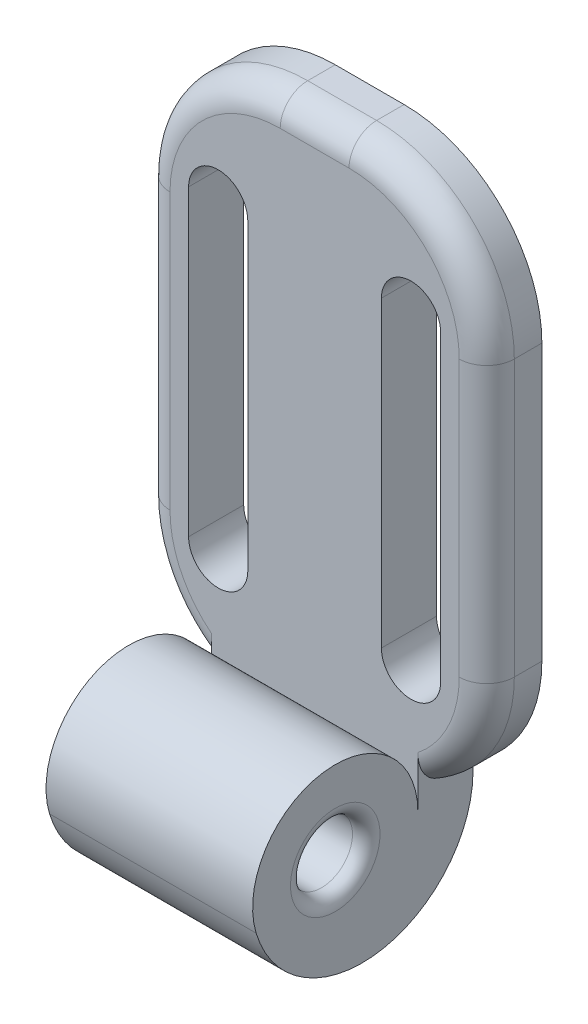
ISO-10303-21;
HEADER;
FILE_DESCRIPTION(('STEP AP214'),'2;1');
FILE_NAME('part.step','',(''),(''),'','','');
FILE_SCHEMA(('AUTOMOTIVE_DESIGN { 1 0 10303 214 1 1 1 1 }'));
ENDSEC;
DATA;
#1=APPLICATION_CONTEXT('core data for automotive mechanical design processes');
#2=APPLICATION_PROTOCOL_DEFINITION('international standard','automotive_design',2000,#1);
#3=PRODUCT_CONTEXT('',#1,'mechanical');
#4=PRODUCT('Part','Part','',(#3));
#5=PRODUCT_RELATED_PRODUCT_CATEGORY('part','',(#4));
#6=PRODUCT_DEFINITION_FORMATION('','',#4);
#7=PRODUCT_DEFINITION_CONTEXT('part definition',#1,'design');
#8=PRODUCT_DEFINITION('design','',#6,#7);
#9=PRODUCT_DEFINITION_SHAPE('','',#8);
#10=(LENGTH_UNIT() NAMED_UNIT(*) SI_UNIT(.MILLI.,.METRE.));
#11=(NAMED_UNIT(*) PLANE_ANGLE_UNIT() SI_UNIT($,.RADIAN.));
#12=(NAMED_UNIT(*) SI_UNIT($,.STERADIAN.) SOLID_ANGLE_UNIT());
#13=UNCERTAINTY_MEASURE_WITH_UNIT(LENGTH_MEASURE(1.E-05),#10,'distance_accuracy_value','');
#14=(GEOMETRIC_REPRESENTATION_CONTEXT(3) GLOBAL_UNCERTAINTY_ASSIGNED_CONTEXT((#13)) GLOBAL_UNIT_ASSIGNED_CONTEXT((#10,
#11,#12)) REPRESENTATION_CONTEXT('',''));
#15=CARTESIAN_POINT('',(0.,0.,0.));
#16=DIRECTION('',(0.,0.,1.));
#17=DIRECTION('',(1.,0.,0.));
#18=AXIS2_PLACEMENT_3D('',#15,#16,#17);
#19=CARTESIAN_POINT('',(2.5,-10.,2.));
#20=DIRECTION('',(0.,0.,-1.));
#21=DIRECTION('',(-1.,0.,0.));
#22=AXIS2_PLACEMENT_3D('',#19,#20,#21);
#23=CYLINDRICAL_SURFACE('',#22,10.);
#24=DIRECTION('',(0.,0.,-1.));
#25=VECTOR('',#24,1.);
#26=CARTESIAN_POINT('',(12.5,-10.,2.));
#27=LINE('',#26,#25);
#28=CARTESIAN_POINT('',(12.5,-10.,0.));
#29=VERTEX_POINT('',#28);
#30=CARTESIAN_POINT('',(12.5,-10.,-2.));
#31=VERTEX_POINT('',#30);
#32=EDGE_CURVE('E331',#29,#31,#27,.T.);
#33=ORIENTED_EDGE('',*,*,#32,.F.);
#34=CARTESIAN_POINT('',(2.5,-10.,0.));
#35=DIRECTION('',(0.,0.,1.));
#36=DIRECTION('',(1.,0.,0.));
#37=AXIS2_PLACEMENT_3D('',#34,#35,#36);
#38=CIRCLE('',#37,10.);
#39=CARTESIAN_POINT('',(7.5,-18.6602540378444,0.));
#40=VERTEX_POINT('',#39);
#41=EDGE_CURVE('E427',#29,#40,#38,.F.);
#42=ORIENTED_EDGE('',*,*,#41,.T.);
#43=DIRECTION('',(0.,0.,-1.));
#44=VECTOR('',#43,1.);
#45=CARTESIAN_POINT('',(7.5,-18.6602540378444,-1.96489611028141));
#46=LINE('',#45,#44);
#47=CARTESIAN_POINT('',(7.5,-18.6602540378444,-1.96489611028141));
#48=VERTEX_POINT('',#47);
#49=EDGE_CURVE('E563',#48,#40,#46,.F.);
#50=ORIENTED_EDGE('',*,*,#49,.F.);
#51=CARTESIAN_POINT('',(2.5,-20.,-1.9783983446287));
#52=CARTESIAN_POINT('',(2.64186760050505,-19.999999746551,-1.97839295554293));
#53=CARTESIAN_POINT('',(2.78371686605524,-19.9969805017068,-1.97862080032294));
#54=CARTESIAN_POINT('',(3.06715795107285,-19.9849116020364,-1.97949540676608));
#55=CARTESIAN_POINT('',(3.20874976943013,-19.9758619212677,-1.98014217023135));
#56=CARTESIAN_POINT('',(3.63281796616455,-19.9396776070167,-1.98263957867114));
#57=CARTESIAN_POINT('',(3.91457509372322,-19.9035077028679,-1.98504733413064));
#58=CARTESIAN_POINT('',(4.46785804455253,-19.8083968762895,-1.99030889522554));
#59=CARTESIAN_POINT('',(4.7394731566663,-19.7499677708788,-1.99315187299346));
#60=CARTESIAN_POINT('',(5.27684720048713,-19.6107277259163,-1.99781955237782));
#61=CARTESIAN_POINT('',(5.54260843205992,-19.5299257518355,-1.99964466100337));
#62=CARTESIAN_POINT('',(5.95059245908701,-19.3870866141653,-2.00012588343242));
#63=CARTESIAN_POINT('',(6.09548428159392,-19.3325481900873,-1.99982633879001));
#64=CARTESIAN_POINT('',(6.38255071250919,-19.2168181772994,-1.99786648805909));
#65=CARTESIAN_POINT('',(6.5247259292577,-19.1556280991463,-1.99620649036492));
#66=CARTESIAN_POINT('',(6.80779316002274,-19.0259320422032,-1.99104764599372));
#67=CARTESIAN_POINT('',(6.94864767155893,-18.9573450812211,-1.98752635396666));
#68=CARTESIAN_POINT('',(7.22696626642258,-18.8136455743175,-1.97811625971671));
#69=CARTESIAN_POINT('',(7.36442917399904,-18.7385308051333,-1.972226648387));
#70=CARTESIAN_POINT('',(7.5,-18.6602540378444,-1.96489611028141));
#71=B_SPLINE_CURVE_WITH_KNOTS('',3,(#51,#52,#53,#54,#55,#56,#57,#58,#59,#60,#61,#62,#63,#64,#65,
#66,#67,#68,#69,#70),.UNSPECIFIED.,.F.,.F.,(4,2,2,2,2,2,2,2,2,4),(0.,0.42553394488738,
0.851069720391812,1.70217713109816,2.53479264828368,3.36707499346229,3.8313781150964,
4.2955760152662,4.76550385534796,5.23559237701044),.UNSPECIFIED.);
#72=CARTESIAN_POINT('',(5.88155054004866,-19.4109040981776,-2.));
#73=VERTEX_POINT('',#72);
#74=EDGE_CURVE('E226',#73,#48,#71,.T.);
#75=ORIENTED_EDGE('',*,*,#74,.F.);
#76=CARTESIAN_POINT('',(2.5,-10.,-2.));
#77=DIRECTION('',(0.,0.,1.));
#78=DIRECTION('',(1.,0.,0.));
#79=AXIS2_PLACEMENT_3D('',#76,#77,#78);
#80=CIRCLE('',#79,10.);
#81=EDGE_CURVE('E317',#31,#73,#80,.F.);
#82=ORIENTED_EDGE('',*,*,#81,.F.);
#83=EDGE_LOOP('',(#33,#42,#50,#75,#82));
#84=FACE_BOUND('',#83,.T.);
#85=ADVANCED_FACE('F38',(#84),#23,.T.);
#86=CARTESIAN_POINT('',(-2.5,-10.,2.));
#87=DIRECTION('',(0.,0.,-1.));
#88=DIRECTION('',(-1.,0.,0.));
#89=AXIS2_PLACEMENT_3D('',#86,#87,#88);
#90=CYLINDRICAL_SURFACE('',#89,10.);
#91=DIRECTION('',(0.,0.,-1.));
#92=VECTOR('',#91,1.);
#93=CARTESIAN_POINT('',(-7.5,-18.6602540378444,2.15148901369864));
#94=LINE('',#93,#92);
#95=CARTESIAN_POINT('',(-7.5,-18.6602540378444,0.));
#96=VERTEX_POINT('',#95);
#97=CARTESIAN_POINT('',(-7.5,-18.6602540378444,-1.96489611028141));
#98=VERTEX_POINT('',#97);
#99=EDGE_CURVE('E342',#96,#98,#94,.T.);
#100=ORIENTED_EDGE('',*,*,#99,.F.);
#101=CARTESIAN_POINT('',(-2.5,-10.,0.));
#102=DIRECTION('',(0.,0.,1.));
#103=DIRECTION('',(1.,0.,0.));
#104=AXIS2_PLACEMENT_3D('',#101,#102,#103);
#105=CIRCLE('',#104,10.);
#106=CARTESIAN_POINT('',(-12.5,-10.,0.));
#107=VERTEX_POINT('',#106);
#108=EDGE_CURVE('E526',#96,#107,#105,.F.);
#109=ORIENTED_EDGE('',*,*,#108,.T.);
#110=DIRECTION('',(0.,0.,-1.));
#111=VECTOR('',#110,1.);
#112=CARTESIAN_POINT('',(-12.5,-10.,2.));
#113=LINE('',#112,#111);
#114=CARTESIAN_POINT('',(-12.5,-10.,-2.));
#115=VERTEX_POINT('',#114);
#116=EDGE_CURVE('E313',#115,#107,#113,.F.);
#117=ORIENTED_EDGE('',*,*,#116,.F.);
#118=CARTESIAN_POINT('',(-2.5,-10.,-2.));
#119=DIRECTION('',(0.,0.,1.));
#120=DIRECTION('',(1.,0.,0.));
#121=AXIS2_PLACEMENT_3D('',#118,#119,#120);
#122=CIRCLE('',#121,10.);
#123=CARTESIAN_POINT('',(-5.88155054004873,-19.4109040981776,-2.));
#124=VERTEX_POINT('',#123);
#125=EDGE_CURVE('E321',#124,#115,#122,.F.);
#126=ORIENTED_EDGE('',*,*,#125,.F.);
#127=CARTESIAN_POINT('',(-7.5,-18.6602540378444,-1.96489611028141));
#128=CARTESIAN_POINT('',(-7.37835741925429,-18.7304853772474,-1.97147584279426));
#129=CARTESIAN_POINT('',(-7.25520689892478,-18.7981676404518,-1.97689182176764));
#130=CARTESIAN_POINT('',(-7.00611731084825,-18.9283061736355,-1.98577464074202));
#131=CARTESIAN_POINT('',(-6.8801784592567,-18.9907628469287,-1.98924163128534));
#132=CARTESIAN_POINT('',(-6.49854517797315,-19.1700933613475,-1.99728667048723));
#133=CARTESIAN_POINT('',(-6.23898279763278,-19.2789572684462,-1.9995112295903));
#134=CARTESIAN_POINT('',(-5.71729600367854,-19.4723152274808,-2.00033426273404));
#135=CARTESIAN_POINT('',(-5.45534544579028,-19.5572811682111,-1.99900935729803));
#136=CARTESIAN_POINT('',(-4.92543964423298,-19.705303077293,-1.99495089409765));
#137=CARTESIAN_POINT('',(-4.6574863536032,-19.7683660648338,-1.99221778831461));
#138=CARTESIAN_POINT('',(-4.07851442157039,-19.8796321951995,-1.98655450483695));
#139=CARTESIAN_POINT('',(-3.76682541344804,-19.9244123891989,-1.98365218480632));
#140=CARTESIAN_POINT('',(-3.29533416928575,-19.9695950009,-1.98058548725858));
#141=CARTESIAN_POINT('',(-3.13651297297785,-19.98099201256,-1.97977679528524));
#142=CARTESIAN_POINT('',(-2.81847007053376,-19.9961951613942,-1.9786788959837));
#143=CARTESIAN_POINT('',(-2.65924828229678,-19.9999995894349,-1.9783898056222));
#144=CARTESIAN_POINT('',(-2.5,-20.,-1.9783983446287));
#145=B_SPLINE_CURVE_WITH_KNOTS('',3,(#127,#128,#129,#130,#131,#132,#133,#134,#135,#136,#137,
#138,#139,#140,#141,#142,#143,#144),.UNSPECIFIED.,.F.,.F.,(4,2,2,2,2,2,2,2,4),(0.,
0.421766860485485,0.843501138688041,1.686792722017,2.5120280583836,3.33699868893002,
4.28015107477193,4.75768996184715,5.23533633349714),.UNSPECIFIED.);
#146=EDGE_CURVE('E344',#98,#124,#145,.T.);
#147=ORIENTED_EDGE('',*,*,#146,.F.);
#148=EDGE_LOOP('',(#100,#109,#117,#126,#147));
#149=FACE_BOUND('',#148,.T.);
#150=ADVANCED_FACE('F370',(#149),#90,.T.);
#151=CARTESIAN_POINT('',(0.,0.,2.));
#152=DIRECTION('',(0.,0.,1.));
#153=DIRECTION('',(1.,0.,0.));
#154=AXIS2_PLACEMENT_3D('',#151,#152,#153);
#155=PLANE('',#154);
#156=DIRECTION('',(0.,1.,0.));
#157=VECTOR('',#156,1.);
#158=CARTESIAN_POINT('',(7.5,0.,2.));
#159=LINE('',#158,#157);
#160=CARTESIAN_POINT('',(7.5,-16.2449979983984,2.));
#161=VERTEX_POINT('',#160);
#162=CARTESIAN_POINT('',(7.5,-20.,2.));
#163=VERTEX_POINT('',#162);
#164=EDGE_CURVE('E214',#161,#163,#159,.F.);
#165=ORIENTED_EDGE('',*,*,#164,.F.);
#166=CARTESIAN_POINT('',(2.5,-10.,2.));
#167=DIRECTION('',(0.,0.,1.));
#168=DIRECTION('',(1.,0.,0.));
#169=AXIS2_PLACEMENT_3D('',#166,#167,#168);
#170=CIRCLE('',#169,8.);
#171=CARTESIAN_POINT('',(10.5,-10.,2.));
#172=VERTEX_POINT('',#171);
#173=EDGE_CURVE('E437',#161,#172,#170,.T.);
#174=ORIENTED_EDGE('',*,*,#173,.T.);
#175=DIRECTION('',(0.,1.,0.));
#176=VECTOR('',#175,1.);
#177=CARTESIAN_POINT('',(10.5,10.,2.));
#178=LINE('',#177,#176);
#179=CARTESIAN_POINT('',(10.5,10.,2.));
#180=VERTEX_POINT('',#179);
#181=EDGE_CURVE('E442',#172,#180,#178,.T.);
#182=ORIENTED_EDGE('',*,*,#181,.T.);
#183=CARTESIAN_POINT('',(2.5,10.,2.));
#184=DIRECTION('',(0.,0.,1.));
#185=DIRECTION('',(1.,0.,0.));
#186=AXIS2_PLACEMENT_3D('',#183,#184,#185);
#187=CIRCLE('',#186,8.);
#188=CARTESIAN_POINT('',(2.5,18.,2.));
#189=VERTEX_POINT('',#188);
#190=EDGE_CURVE('E500',#180,#189,#187,.T.);
#191=ORIENTED_EDGE('',*,*,#190,.T.);
#192=DIRECTION('',(-1.,0.,0.));
#193=VECTOR('',#192,1.);
#194=CARTESIAN_POINT('',(-2.5,18.,2.));
#195=LINE('',#194,#193);
#196=CARTESIAN_POINT('',(-2.5,18.,2.));
#197=VERTEX_POINT('',#196);
#198=EDGE_CURVE('E504',#189,#197,#195,.T.);
#199=ORIENTED_EDGE('',*,*,#198,.T.);
#200=CARTESIAN_POINT('',(-2.5,10.,2.));
#201=DIRECTION('',(0.,0.,1.));
#202=DIRECTION('',(1.,0.,0.));
#203=AXIS2_PLACEMENT_3D('',#200,#201,#202);
#204=CIRCLE('',#203,8.);
#205=CARTESIAN_POINT('',(-10.5,10.,2.));
#206=VERTEX_POINT('',#205);
#207=EDGE_CURVE('E508',#197,#206,#204,.T.);
#208=ORIENTED_EDGE('',*,*,#207,.T.);
#209=DIRECTION('',(0.,-1.,0.));
#210=VECTOR('',#209,1.);
#211=CARTESIAN_POINT('',(-10.5,-10.,2.));
#212=LINE('',#211,#210);
#213=CARTESIAN_POINT('',(-10.5,-10.,2.));
#214=VERTEX_POINT('',#213);
#215=EDGE_CURVE('E511',#206,#214,#212,.T.);
#216=ORIENTED_EDGE('',*,*,#215,.T.);
#217=CARTESIAN_POINT('',(-2.5,-10.,2.));
#218=DIRECTION('',(0.,0.,1.));
#219=DIRECTION('',(1.,0.,0.));
#220=AXIS2_PLACEMENT_3D('',#217,#218,#219);
#221=CIRCLE('',#220,8.);
#222=CARTESIAN_POINT('',(-7.5,-16.2449979983984,2.));
#223=VERTEX_POINT('',#222);
#224=EDGE_CURVE('E518',#214,#223,#221,.T.);
#225=ORIENTED_EDGE('',*,*,#224,.T.);
#226=DIRECTION('',(0.,-1.,0.));
#227=VECTOR('',#226,1.);
#228=CARTESIAN_POINT('',(-7.5,0.,2.));
#229=LINE('',#228,#227);
#230=CARTESIAN_POINT('',(-7.5,-20.,2.));
#231=VERTEX_POINT('',#230);
#232=EDGE_CURVE('E509',#223,#231,#229,.T.);
#233=ORIENTED_EDGE('',*,*,#232,.T.);
#234=DIRECTION('',(-1.,0.,0.));
#235=VECTOR('',#234,1.);
#236=CARTESIAN_POINT('',(7.5,-20.,2.));
#237=LINE('',#236,#235);
#238=EDGE_CURVE('E227',#163,#231,#237,.T.);
#239=ORIENTED_EDGE('',*,*,#238,.F.);
#240=EDGE_LOOP('',(#165,#174,#182,#191,#199,#208,#216,#225,#233,#239));
#241=FACE_BOUND('',#240,.T.);
#242=DIRECTION('',(0.,1.,0.));
#243=VECTOR('',#242,1.);
#244=CARTESIAN_POINT('',(-4.85,-11.,2.));
#245=LINE('',#244,#243);
#246=CARTESIAN_POINT('',(-4.85,-11.,2.));
#247=VERTEX_POINT('',#246);
#248=CARTESIAN_POINT('',(-4.85,11.,2.));
#249=VERTEX_POINT('',#248);
#250=EDGE_CURVE('E273',#247,#249,#245,.T.);
#251=ORIENTED_EDGE('',*,*,#250,.F.);
#252=CARTESIAN_POINT('',(-7.,-11.,2.));
#253=DIRECTION('',(0.,0.,1.));
#254=DIRECTION('',(1.,0.,0.));
#255=AXIS2_PLACEMENT_3D('',#252,#253,#254);
#256=CIRCLE('',#255,2.15);
#257=CARTESIAN_POINT('',(-9.15,-11.,2.));
#258=VERTEX_POINT('',#257);
#259=EDGE_CURVE('E271',#258,#247,#256,.T.);
#260=ORIENTED_EDGE('',*,*,#259,.F.);
#261=DIRECTION('',(0.,-1.,0.));
#262=VECTOR('',#261,1.);
#263=CARTESIAN_POINT('',(-9.15,-11.,2.));
#264=LINE('',#263,#262);
#265=CARTESIAN_POINT('',(-9.15,11.,2.));
#266=VERTEX_POINT('',#265);
#267=EDGE_CURVE('E279',#266,#258,#264,.T.);
#268=ORIENTED_EDGE('',*,*,#267,.F.);
#269=CARTESIAN_POINT('',(-7.,11.,2.));
#270=DIRECTION('',(0.,0.,1.));
#271=DIRECTION('',(1.,0.,0.));
#272=AXIS2_PLACEMENT_3D('',#269,#270,#271);
#273=CIRCLE('',#272,2.15);
#274=EDGE_CURVE('E276',#249,#266,#273,.T.);
#275=ORIENTED_EDGE('',*,*,#274,.F.);
#276=EDGE_LOOP('',(#251,#260,#268,#275));
#277=FACE_BOUND('',#276,.T.);
#278=DIRECTION('',(0.,1.,0.));
#279=VECTOR('',#278,1.);
#280=CARTESIAN_POINT('',(9.15,-11.,2.));
#281=LINE('',#280,#279);
#282=CARTESIAN_POINT('',(9.15,-11.,2.));
#283=VERTEX_POINT('',#282);
#284=CARTESIAN_POINT('',(9.15,11.,2.));
#285=VERTEX_POINT('',#284);
#286=EDGE_CURVE('E245',#283,#285,#281,.T.);
#287=ORIENTED_EDGE('',*,*,#286,.F.);
#288=CARTESIAN_POINT('',(7.,-11.,2.));
#289=DIRECTION('',(0.,0.,1.));
#290=DIRECTION('',(-1.,0.,0.));
#291=AXIS2_PLACEMENT_3D('',#288,#289,#290);
#292=CIRCLE('',#291,2.15);
#293=CARTESIAN_POINT('',(4.85,-11.,2.));
#294=VERTEX_POINT('',#293);
#295=EDGE_CURVE('E243',#294,#283,#292,.T.);
#296=ORIENTED_EDGE('',*,*,#295,.F.);
#297=DIRECTION('',(0.,-1.,0.));
#298=VECTOR('',#297,1.);
#299=CARTESIAN_POINT('',(4.85,-11.,2.));
#300=LINE('',#299,#298);
#301=CARTESIAN_POINT('',(4.85,11.,2.));
#302=VERTEX_POINT('',#301);
#303=EDGE_CURVE('E251',#302,#294,#300,.T.);
#304=ORIENTED_EDGE('',*,*,#303,.F.);
#305=CARTESIAN_POINT('',(7.,11.,2.));
#306=DIRECTION('',(0.,0.,1.));
#307=DIRECTION('',(-1.,0.,0.));
#308=AXIS2_PLACEMENT_3D('',#305,#306,#307);
#309=CIRCLE('',#308,2.15);
#310=EDGE_CURVE('E248',#285,#302,#309,.T.);
#311=ORIENTED_EDGE('',*,*,#310,.F.);
#312=EDGE_LOOP('',(#287,#296,#304,#311));
#313=FACE_BOUND('',#312,.T.);
#314=ADVANCED_FACE('F422',(#241,#277,#313),#155,.T.);
#315=CARTESIAN_POINT('',(0.,0.,-2.));
#316=DIRECTION('',(0.,0.,1.));
#317=DIRECTION('',(1.,0.,0.));
#318=AXIS2_PLACEMENT_3D('',#315,#316,#317);
#319=PLANE('',#318);
#320=CARTESIAN_POINT('',(-7.,-11.,-2.));
#321=DIRECTION('',(0.,0.,1.));
#322=DIRECTION('',(1.,0.,0.));
#323=AXIS2_PLACEMENT_3D('',#320,#321,#322);
#324=CIRCLE('',#323,2.15);
#325=CARTESIAN_POINT('',(-9.15,-11.,-2.));
#326=VERTEX_POINT('',#325);
#327=CARTESIAN_POINT('',(-4.85,-11.,-2.));
#328=VERTEX_POINT('',#327);
#329=EDGE_CURVE('E270',#326,#328,#324,.T.);
#330=ORIENTED_EDGE('',*,*,#329,.T.);
#331=DIRECTION('',(0.,1.,0.));
#332=VECTOR('',#331,1.);
#333=CARTESIAN_POINT('',(-4.85,-11.,-2.));
#334=LINE('',#333,#332);
#335=CARTESIAN_POINT('',(-4.85,11.,-2.));
#336=VERTEX_POINT('',#335);
#337=EDGE_CURVE('E284',#328,#336,#334,.T.);
#338=ORIENTED_EDGE('',*,*,#337,.T.);
#339=CARTESIAN_POINT('',(-7.,11.,-2.));
#340=DIRECTION('',(0.,0.,1.));
#341=DIRECTION('',(1.,0.,0.));
#342=AXIS2_PLACEMENT_3D('',#339,#340,#341);
#343=CIRCLE('',#342,2.15);
#344=CARTESIAN_POINT('',(-9.15,11.,-2.));
#345=VERTEX_POINT('',#344);
#346=EDGE_CURVE('E287',#336,#345,#343,.T.);
#347=ORIENTED_EDGE('',*,*,#346,.T.);
#348=DIRECTION('',(0.,-1.,0.));
#349=VECTOR('',#348,1.);
#350=CARTESIAN_POINT('',(-9.15,-11.,-2.));
#351=LINE('',#350,#349);
#352=EDGE_CURVE('E274',#345,#326,#351,.T.);
#353=ORIENTED_EDGE('',*,*,#352,.T.);
#354=EDGE_LOOP('',(#330,#338,#347,#353));
#355=FACE_BOUND('',#354,.T.);
#356=DIRECTION('',(0.,-1.,0.));
#357=VECTOR('',#356,1.);
#358=CARTESIAN_POINT('',(-12.5,-20.,-2.));
#359=LINE('',#358,#357);
#360=CARTESIAN_POINT('',(-12.5,10.,-2.));
#361=VERTEX_POINT('',#360);
#362=EDGE_CURVE('E301',#361,#115,#359,.T.);
#363=ORIENTED_EDGE('',*,*,#362,.F.);
#364=CARTESIAN_POINT('',(-2.5,10.,-2.));
#365=DIRECTION('',(0.,0.,1.));
#366=DIRECTION('',(1.,0.,0.));
#367=AXIS2_PLACEMENT_3D('',#364,#365,#366);
#368=CIRCLE('',#367,10.);
#369=CARTESIAN_POINT('',(-2.5,20.,-2.));
#370=VERTEX_POINT('',#369);
#371=EDGE_CURVE('E325',#361,#370,#368,.F.);
#372=ORIENTED_EDGE('',*,*,#371,.T.);
#373=DIRECTION('',(-1.,0.,0.));
#374=VECTOR('',#373,1.);
#375=CARTESIAN_POINT('',(12.5,20.,-2.));
#376=LINE('',#375,#374);
#377=CARTESIAN_POINT('',(2.5,20.,-2.));
#378=VERTEX_POINT('',#377);
#379=EDGE_CURVE('E310',#378,#370,#376,.T.);
#380=ORIENTED_EDGE('',*,*,#379,.F.);
#381=CARTESIAN_POINT('',(2.5,10.,-2.));
#382=DIRECTION('',(0.,0.,1.));
#383=DIRECTION('',(1.,0.,0.));
#384=AXIS2_PLACEMENT_3D('',#381,#382,#383);
#385=CIRCLE('',#384,10.);
#386=CARTESIAN_POINT('',(12.5,10.,-2.));
#387=VERTEX_POINT('',#386);
#388=EDGE_CURVE('E323',#378,#387,#385,.F.);
#389=ORIENTED_EDGE('',*,*,#388,.T.);
#390=DIRECTION('',(0.,1.,0.));
#391=VECTOR('',#390,1.);
#392=CARTESIAN_POINT('',(12.5,-20.,-2.));
#393=LINE('',#392,#391);
#394=EDGE_CURVE('E307',#31,#387,#393,.T.);
#395=ORIENTED_EDGE('',*,*,#394,.F.);
#396=ORIENTED_EDGE('',*,*,#81,.T.);
#397=CARTESIAN_POINT('',(2.5,-20.,-2.));
#398=VERTEX_POINT('',#397);
#399=EDGE_CURVE('E318',#73,#398,#80,.F.);
#400=ORIENTED_EDGE('',*,*,#399,.T.);
#401=DIRECTION('',(1.,0.,0.));
#402=VECTOR('',#401,1.);
#403=CARTESIAN_POINT('',(12.5,-20.,-2.));
#404=LINE('',#403,#402);
#405=CARTESIAN_POINT('',(-2.5,-20.,-2.));
#406=VERTEX_POINT('',#405);
#407=EDGE_CURVE('E304',#406,#398,#404,.T.);
#408=ORIENTED_EDGE('',*,*,#407,.F.);
#409=EDGE_CURVE('E320',#406,#124,#122,.F.);
#410=ORIENTED_EDGE('',*,*,#409,.T.);
#411=ORIENTED_EDGE('',*,*,#125,.T.);
#412=EDGE_LOOP('',(#363,#372,#380,#389,#395,#396,#400,#408,#410,#411));
#413=FACE_BOUND('',#412,.T.);
#414=CARTESIAN_POINT('',(7.,-11.,-2.));
#415=DIRECTION('',(0.,0.,1.));
#416=DIRECTION('',(-1.,0.,0.));
#417=AXIS2_PLACEMENT_3D('',#414,#415,#416);
#418=CIRCLE('',#417,2.15);
#419=CARTESIAN_POINT('',(4.85,-11.,-2.));
#420=VERTEX_POINT('',#419);
#421=CARTESIAN_POINT('',(9.15,-11.,-2.));
#422=VERTEX_POINT('',#421);
#423=EDGE_CURVE('E233',#420,#422,#418,.T.);
#424=ORIENTED_EDGE('',*,*,#423,.T.);
#425=DIRECTION('',(0.,1.,0.));
#426=VECTOR('',#425,1.);
#427=CARTESIAN_POINT('',(9.15,-11.,-2.));
#428=LINE('',#427,#426);
#429=CARTESIAN_POINT('',(9.15,11.,-2.));
#430=VERTEX_POINT('',#429);
#431=EDGE_CURVE('E237',#422,#430,#428,.T.);
#432=ORIENTED_EDGE('',*,*,#431,.T.);
#433=CARTESIAN_POINT('',(7.,11.,-2.));
#434=DIRECTION('',(0.,0.,1.));
#435=DIRECTION('',(-1.,0.,0.));
#436=AXIS2_PLACEMENT_3D('',#433,#434,#435);
#437=CIRCLE('',#436,2.15);
#438=CARTESIAN_POINT('',(4.85,11.,-2.));
#439=VERTEX_POINT('',#438);
#440=EDGE_CURVE('E256',#430,#439,#437,.T.);
#441=ORIENTED_EDGE('',*,*,#440,.T.);
#442=DIRECTION('',(0.,-1.,0.));
#443=VECTOR('',#442,1.);
#444=CARTESIAN_POINT('',(4.85,-11.,-2.));
#445=LINE('',#444,#443);
#446=EDGE_CURVE('E246',#439,#420,#445,.T.);
#447=ORIENTED_EDGE('',*,*,#446,.T.);
#448=EDGE_LOOP('',(#424,#432,#441,#447));
#449=FACE_BOUND('',#448,.T.);
#450=ADVANCED_FACE('F537',(#355,#413,#449),#319,.F.);
#451=CARTESIAN_POINT('',(-12.5,-20.,2.));
#452=DIRECTION('',(1.,0.,0.));
#453=DIRECTION('',(0.,0.,-1.));
#454=AXIS2_PLACEMENT_3D('',#451,#452,#453);
#455=PLANE('',#454);
#456=ORIENTED_EDGE('',*,*,#116,.T.);
#457=DIRECTION('',(0.,-1.,0.));
#458=VECTOR('',#457,1.);
#459=CARTESIAN_POINT('',(-12.5,10.,0.));
#460=LINE('',#459,#458);
#461=CARTESIAN_POINT('',(-12.5,10.,0.));
#462=VERTEX_POINT('',#461);
#463=EDGE_CURVE('E61',#107,#462,#460,.F.);
#464=ORIENTED_EDGE('',*,*,#463,.T.);
#465=DIRECTION('',(0.,0.,-1.));
#466=VECTOR('',#465,1.);
#467=CARTESIAN_POINT('',(-12.5,10.,2.));
#468=LINE('',#467,#466);
#469=EDGE_CURVE('E315',#462,#361,#468,.T.);
#470=ORIENTED_EDGE('',*,*,#469,.T.);
#471=ORIENTED_EDGE('',*,*,#362,.T.);
#472=EDGE_LOOP('',(#456,#464,#470,#471));
#473=FACE_BOUND('',#472,.T.);
#474=ADVANCED_FACE('F543',(#473),#455,.F.);
#475=CARTESIAN_POINT('',(12.5,-20.,2.));
#476=DIRECTION('',(0.,1.,0.));
#477=DIRECTION('',(0.,0.,1.));
#478=AXIS2_PLACEMENT_3D('',#475,#476,#477);
#479=PLANE('',#478);
#480=DIRECTION('',(-1.,0.,0.));
#481=VECTOR('',#480,1.);
#482=CARTESIAN_POINT('',(7.5,-20.,-1.9783983446287));
#483=LINE('',#482,#481);
#484=CARTESIAN_POINT('',(2.5,-20.,-1.9783983446287));
#485=VERTEX_POINT('',#484);
#486=CARTESIAN_POINT('',(-2.5,-20.,-1.9783983446287));
#487=VERTEX_POINT('',#486);
#488=EDGE_CURVE('E234',#485,#487,#483,.T.);
#489=ORIENTED_EDGE('',*,*,#488,.T.);
#490=DIRECTION('',(0.,0.,-1.));
#491=VECTOR('',#490,1.);
#492=CARTESIAN_POINT('',(-2.5,-20.,2.));
#493=LINE('',#492,#491);
#494=EDGE_CURVE('E339',#487,#406,#493,.T.);
#495=ORIENTED_EDGE('',*,*,#494,.T.);
#496=ORIENTED_EDGE('',*,*,#407,.T.);
#497=DIRECTION('',(0.,0.,-1.));
#498=VECTOR('',#497,1.);
#499=CARTESIAN_POINT('',(2.5,-20.,2.));
#500=LINE('',#499,#498);
#501=EDGE_CURVE('E336',#398,#485,#500,.F.);
#502=ORIENTED_EDGE('',*,*,#501,.T.);
#503=EDGE_LOOP('',(#489,#495,#496,#502));
#504=FACE_BOUND('',#503,.T.);
#505=ADVANCED_FACE('F560',(#504),#479,.F.);
#506=CARTESIAN_POINT('',(12.5,-20.,2.));
#507=DIRECTION('',(-1.,0.,0.));
#508=DIRECTION('',(0.,0.,1.));
#509=AXIS2_PLACEMENT_3D('',#506,#507,#508);
#510=PLANE('',#509);
#511=DIRECTION('',(0.,0.,-1.));
#512=VECTOR('',#511,1.);
#513=CARTESIAN_POINT('',(12.5,10.,2.));
#514=LINE('',#513,#512);
#515=CARTESIAN_POINT('',(12.5,10.,0.));
#516=VERTEX_POINT('',#515);
#517=EDGE_CURVE('E333',#387,#516,#514,.F.);
#518=ORIENTED_EDGE('',*,*,#517,.T.);
#519=DIRECTION('',(0.,1.,0.));
#520=VECTOR('',#519,1.);
#521=CARTESIAN_POINT('',(12.5,-10.,0.));
#522=LINE('',#521,#520);
#523=EDGE_CURVE('E436',#516,#29,#522,.F.);
#524=ORIENTED_EDGE('',*,*,#523,.T.);
#525=ORIENTED_EDGE('',*,*,#32,.T.);
#526=ORIENTED_EDGE('',*,*,#394,.T.);
#527=EDGE_LOOP('',(#518,#524,#525,#526));
#528=FACE_BOUND('',#527,.T.);
#529=ADVANCED_FACE('F564',(#528),#510,.F.);
#530=CARTESIAN_POINT('',(12.5,20.,2.));
#531=DIRECTION('',(0.,-1.,0.));
#532=DIRECTION('',(0.,0.,-1.));
#533=AXIS2_PLACEMENT_3D('',#530,#531,#532);
#534=PLANE('',#533);
#535=DIRECTION('',(0.,0.,-1.));
#536=VECTOR('',#535,1.);
#537=CARTESIAN_POINT('',(-2.5,20.,2.));
#538=LINE('',#537,#536);
#539=CARTESIAN_POINT('',(-2.5,20.,0.));
#540=VERTEX_POINT('',#539);
#541=EDGE_CURVE('E329',#370,#540,#538,.F.);
#542=ORIENTED_EDGE('',*,*,#541,.T.);
#543=DIRECTION('',(-1.,0.,0.));
#544=VECTOR('',#543,1.);
#545=CARTESIAN_POINT('',(2.5,20.,0.));
#546=LINE('',#545,#544);
#547=CARTESIAN_POINT('',(2.5,20.,0.));
#548=VERTEX_POINT('',#547);
#549=EDGE_CURVE('E395',#540,#548,#546,.F.);
#550=ORIENTED_EDGE('',*,*,#549,.T.);
#551=DIRECTION('',(0.,0.,-1.));
#552=VECTOR('',#551,1.);
#553=CARTESIAN_POINT('',(2.5,20.,2.));
#554=LINE('',#553,#552);
#555=EDGE_CURVE('E327',#548,#378,#554,.T.);
#556=ORIENTED_EDGE('',*,*,#555,.T.);
#557=ORIENTED_EDGE('',*,*,#379,.T.);
#558=EDGE_LOOP('',(#542,#550,#556,#557));
#559=FACE_BOUND('',#558,.T.);
#560=ADVANCED_FACE('F530',(#559),#534,.F.);
#561=CARTESIAN_POINT('',(-7.,-11.,2.));
#562=DIRECTION('',(0.,0.,-1.));
#563=DIRECTION('',(-1.,0.,0.));
#564=AXIS2_PLACEMENT_3D('',#561,#562,#563);
#565=CYLINDRICAL_SURFACE('',#564,2.15);
#566=ORIENTED_EDGE('',*,*,#329,.F.);
#567=DIRECTION('',(0.,0.,-1.));
#568=VECTOR('',#567,1.);
#569=CARTESIAN_POINT('',(-9.15,-11.,2.));
#570=LINE('',#569,#568);
#571=EDGE_CURVE('E281',#258,#326,#570,.T.);
#572=ORIENTED_EDGE('',*,*,#571,.F.);
#573=ORIENTED_EDGE('',*,*,#259,.T.);
#574=DIRECTION('',(0.,0.,-1.));
#575=VECTOR('',#574,1.);
#576=CARTESIAN_POINT('',(-4.85,-11.,2.));
#577=LINE('',#576,#575);
#578=EDGE_CURVE('E298',#247,#328,#577,.T.);
#579=ORIENTED_EDGE('',*,*,#578,.T.);
#580=EDGE_LOOP('',(#566,#572,#573,#579));
#581=FACE_BOUND('',#580,.T.);
#582=ADVANCED_FACE('F571',(#581),#565,.F.);
#583=CARTESIAN_POINT('',(-4.85,-11.,2.));
#584=DIRECTION('',(-1.,0.,0.));
#585=DIRECTION('',(0.,0.,1.));
#586=AXIS2_PLACEMENT_3D('',#583,#584,#585);
#587=PLANE('',#586);
#588=ORIENTED_EDGE('',*,*,#337,.F.);
#589=ORIENTED_EDGE('',*,*,#578,.F.);
#590=ORIENTED_EDGE('',*,*,#250,.T.);
#591=DIRECTION('',(0.,0.,-1.));
#592=VECTOR('',#591,1.);
#593=CARTESIAN_POINT('',(-4.85,11.,2.));
#594=LINE('',#593,#592);
#595=EDGE_CURVE('E296',#249,#336,#594,.T.);
#596=ORIENTED_EDGE('',*,*,#595,.T.);
#597=EDGE_LOOP('',(#588,#589,#590,#596));
#598=FACE_BOUND('',#597,.T.);
#599=ADVANCED_FACE('F588',(#598),#587,.T.);
#600=CARTESIAN_POINT('',(-7.,11.,2.));
#601=DIRECTION('',(0.,0.,-1.));
#602=DIRECTION('',(-1.,0.,0.));
#603=AXIS2_PLACEMENT_3D('',#600,#601,#602);
#604=CYLINDRICAL_SURFACE('',#603,2.15);
#605=ORIENTED_EDGE('',*,*,#346,.F.);
#606=ORIENTED_EDGE('',*,*,#595,.F.);
#607=ORIENTED_EDGE('',*,*,#274,.T.);
#608=DIRECTION('',(0.,0.,-1.));
#609=VECTOR('',#608,1.);
#610=CARTESIAN_POINT('',(-9.15,11.,2.));
#611=LINE('',#610,#609);
#612=EDGE_CURVE('E294',#266,#345,#611,.T.);
#613=ORIENTED_EDGE('',*,*,#612,.T.);
#614=EDGE_LOOP('',(#605,#606,#607,#613));
#615=FACE_BOUND('',#614,.T.);
#616=ADVANCED_FACE('F592',(#615),#604,.F.);
#617=CARTESIAN_POINT('',(-9.15,-11.,2.));
#618=DIRECTION('',(1.,0.,0.));
#619=DIRECTION('',(0.,0.,-1.));
#620=AXIS2_PLACEMENT_3D('',#617,#618,#619);
#621=PLANE('',#620);
#622=ORIENTED_EDGE('',*,*,#352,.F.);
#623=ORIENTED_EDGE('',*,*,#612,.F.);
#624=ORIENTED_EDGE('',*,*,#267,.T.);
#625=ORIENTED_EDGE('',*,*,#571,.T.);
#626=EDGE_LOOP('',(#622,#623,#624,#625));
#627=FACE_BOUND('',#626,.T.);
#628=ADVANCED_FACE('F596',(#627),#621,.T.);
#629=CARTESIAN_POINT('',(7.,-11.,2.));
#630=DIRECTION('',(0.,0.,-1.));
#631=DIRECTION('',(-1.,0.,0.));
#632=AXIS2_PLACEMENT_3D('',#629,#630,#631);
#633=CYLINDRICAL_SURFACE('',#632,2.15);
#634=ORIENTED_EDGE('',*,*,#423,.F.);
#635=DIRECTION('',(0.,0.,-1.));
#636=VECTOR('',#635,1.);
#637=CARTESIAN_POINT('',(4.85,-11.,2.));
#638=LINE('',#637,#636);
#639=EDGE_CURVE('E252',#294,#420,#638,.T.);
#640=ORIENTED_EDGE('',*,*,#639,.F.);
#641=ORIENTED_EDGE('',*,*,#295,.T.);
#642=DIRECTION('',(0.,0.,-1.));
#643=VECTOR('',#642,1.);
#644=CARTESIAN_POINT('',(9.15,-11.,2.));
#645=LINE('',#644,#643);
#646=EDGE_CURVE('E267',#283,#422,#645,.T.);
#647=ORIENTED_EDGE('',*,*,#646,.T.);
#648=EDGE_LOOP('',(#634,#640,#641,#647));
#649=FACE_BOUND('',#648,.T.);
#650=ADVANCED_FACE('F600',(#649),#633,.F.);
#651=CARTESIAN_POINT('',(9.15,-11.,2.));
#652=DIRECTION('',(-1.,0.,0.));
#653=DIRECTION('',(0.,0.,1.));
#654=AXIS2_PLACEMENT_3D('',#651,#652,#653);
#655=PLANE('',#654);
#656=ORIENTED_EDGE('',*,*,#431,.F.);
#657=ORIENTED_EDGE('',*,*,#646,.F.);
#658=ORIENTED_EDGE('',*,*,#286,.T.);
#659=DIRECTION('',(0.,0.,-1.));
#660=VECTOR('',#659,1.);
#661=CARTESIAN_POINT('',(9.15,11.,2.));
#662=LINE('',#661,#660);
#663=EDGE_CURVE('E265',#285,#430,#662,.T.);
#664=ORIENTED_EDGE('',*,*,#663,.T.);
#665=EDGE_LOOP('',(#656,#657,#658,#664));
#666=FACE_BOUND('',#665,.T.);
#667=ADVANCED_FACE('F604',(#666),#655,.T.);
#668=CARTESIAN_POINT('',(7.,11.,2.));
#669=DIRECTION('',(0.,0.,-1.));
#670=DIRECTION('',(-1.,0.,0.));
#671=AXIS2_PLACEMENT_3D('',#668,#669,#670);
#672=CYLINDRICAL_SURFACE('',#671,2.15);
#673=ORIENTED_EDGE('',*,*,#440,.F.);
#674=ORIENTED_EDGE('',*,*,#663,.F.);
#675=ORIENTED_EDGE('',*,*,#310,.T.);
#676=DIRECTION('',(0.,0.,-1.));
#677=VECTOR('',#676,1.);
#678=CARTESIAN_POINT('',(4.85,11.,2.));
#679=LINE('',#678,#677);
#680=EDGE_CURVE('E263',#302,#439,#679,.T.);
#681=ORIENTED_EDGE('',*,*,#680,.T.);
#682=EDGE_LOOP('',(#673,#674,#675,#681));
#683=FACE_BOUND('',#682,.T.);
#684=ADVANCED_FACE('F608',(#683),#672,.F.);
#685=CARTESIAN_POINT('',(4.85,-11.,2.));
#686=DIRECTION('',(1.,0.,0.));
#687=DIRECTION('',(0.,0.,-1.));
#688=AXIS2_PLACEMENT_3D('',#685,#686,#687);
#689=PLANE('',#688);
#690=ORIENTED_EDGE('',*,*,#446,.F.);
#691=ORIENTED_EDGE('',*,*,#680,.F.);
#692=ORIENTED_EDGE('',*,*,#303,.T.);
#693=ORIENTED_EDGE('',*,*,#639,.T.);
#694=EDGE_LOOP('',(#690,#691,#692,#693));
#695=FACE_BOUND('',#694,.T.);
#696=ADVANCED_FACE('F612',(#695),#689,.T.);
#697=CARTESIAN_POINT('',(7.5,-20.,8.));
#698=DIRECTION('',(-1.,0.,0.));
#699=DIRECTION('',(0.,0.,1.));
#700=AXIS2_PLACEMENT_3D('',#697,#698,#699);
#701=CYLINDRICAL_SURFACE('',#700,6.);
#702=ORIENTED_EDGE('',*,*,#238,.T.);
#703=CARTESIAN_POINT('',(-7.5,-20.,8.));
#704=DIRECTION('',(1.,0.,0.));
#705=DIRECTION('',(0.,0.,-1.));
#706=AXIS2_PLACEMENT_3D('',#703,#704,#705);
#707=CIRCLE('',#706,6.);
#708=CARTESIAN_POINT('',(-7.5,-21.7297696523662,13.7452499466736));
#709=VERTEX_POINT('',#708);
#710=EDGE_CURVE('E231',#231,#709,#707,.T.);
#711=ORIENTED_EDGE('',*,*,#710,.T.);
#712=DIRECTION('',(-1.,0.,0.));
#713=VECTOR('',#712,1.);
#714=CARTESIAN_POINT('',(7.5,-21.7297696523662,13.7452499466736));
#715=LINE('',#714,#713);
#716=CARTESIAN_POINT('',(7.5,-21.7297696523662,13.7452499466736));
#717=VERTEX_POINT('',#716);
#718=EDGE_CURVE('E224',#717,#709,#715,.T.);
#719=ORIENTED_EDGE('',*,*,#718,.F.);
#720=CARTESIAN_POINT('',(7.5,-20.,8.));
#721=DIRECTION('',(1.,0.,0.));
#722=DIRECTION('',(0.,0.,-1.));
#723=AXIS2_PLACEMENT_3D('',#720,#721,#722);
#724=CIRCLE('',#723,6.);
#725=EDGE_CURVE('E207',#163,#717,#724,.T.);
#726=ORIENTED_EDGE('',*,*,#725,.F.);
#727=EDGE_LOOP('',(#702,#711,#719,#726));
#728=FACE_BOUND('',#727,.T.);
#729=ADVANCED_FACE('F229',(#728),#701,.T.);
#730=CARTESIAN_POINT('',(7.5,-19.4109040981776,6.04337924769299));
#731=DIRECTION('',(-1.,0.,0.));
#732=DIRECTION('',(0.,0.,1.));
#733=AXIS2_PLACEMENT_3D('',#730,#731,#732);
#734=CYLINDRICAL_SURFACE('',#733,8.04337924769299);
#735=CARTESIAN_POINT('',(-7.5,-19.4109040981776,6.04337924769299));
#736=DIRECTION('',(1.,0.,0.));
#737=DIRECTION('',(0.,0.,-1.));
#738=AXIS2_PLACEMENT_3D('',#735,#736,#737);
#739=CIRCLE('',#738,8.04337924769299);
#740=EDGE_CURVE('E218',#709,#98,#739,.T.);
#741=ORIENTED_EDGE('',*,*,#740,.T.);
#742=ORIENTED_EDGE('',*,*,#146,.T.);
#743=EDGE_CURVE('E345',#124,#487,#145,.T.);
#744=ORIENTED_EDGE('',*,*,#743,.T.);
#745=ORIENTED_EDGE('',*,*,#488,.F.);
#746=EDGE_CURVE('E353',#485,#73,#71,.T.);
#747=ORIENTED_EDGE('',*,*,#746,.T.);
#748=ORIENTED_EDGE('',*,*,#74,.T.);
#749=CARTESIAN_POINT('',(7.5,-19.4109040981776,6.04337924769299));
#750=DIRECTION('',(1.,0.,0.));
#751=DIRECTION('',(0.,0.,-1.));
#752=AXIS2_PLACEMENT_3D('',#749,#750,#751);
#753=CIRCLE('',#752,8.04337924769299);
#754=EDGE_CURVE('E211',#717,#48,#753,.T.);
#755=ORIENTED_EDGE('',*,*,#754,.F.);
#756=ORIENTED_EDGE('',*,*,#718,.T.);
#757=EDGE_LOOP('',(#741,#742,#744,#745,#747,#748,#755,#756));
#758=FACE_BOUND('',#757,.T.);
#759=ADVANCED_FACE('F223',(#758),#734,.T.);
#760=CARTESIAN_POINT('',(7.5,-20.,8.));
#761=DIRECTION('',(-1.,0.,0.));
#762=DIRECTION('',(0.,0.,1.));
#763=AXIS2_PLACEMENT_3D('',#760,#761,#762);
#764=CYLINDRICAL_SURFACE('',#763,2.25);
#765=CARTESIAN_POINT('',(-6.5,-20.,8.));
#766=DIRECTION('',(1.,0.,0.));
#767=DIRECTION('',(0.,0.,-1.));
#768=AXIS2_PLACEMENT_3D('',#765,#766,#767);
#769=CIRCLE('',#768,2.25);
#770=CARTESIAN_POINT('',(-6.5,-20.,5.75));
#771=VERTEX_POINT('',#770);
#772=EDGE_CURVE('E46',#771,#771,#769,.F.);
#773=ORIENTED_EDGE('',*,*,#772,.T.);
#774=EDGE_LOOP('',(#773));
#775=FACE_BOUND('',#774,.T.);
#776=CARTESIAN_POINT('',(6.5,-20.,8.));
#777=DIRECTION('',(1.,0.,0.));
#778=DIRECTION('',(0.,0.,-1.));
#779=AXIS2_PLACEMENT_3D('',#776,#777,#778);
#780=CIRCLE('',#779,2.25);
#781=CARTESIAN_POINT('',(6.5,-20.,5.75));
#782=VERTEX_POINT('',#781);
#783=EDGE_CURVE('E461',#782,#782,#780,.T.);
#784=ORIENTED_EDGE('',*,*,#783,.T.);
#785=EDGE_LOOP('',(#784));
#786=FACE_BOUND('',#785,.T.);
#787=ADVANCED_FACE('F406',(#775,#786),#764,.F.);
#788=CARTESIAN_POINT('',(7.5,0.,0.));
#789=DIRECTION('',(1.,0.,0.));
#790=DIRECTION('',(0.,0.,-1.));
#791=AXIS2_PLACEMENT_3D('',#788,#789,#790);
#792=PLANE('',#791);
#793=CARTESIAN_POINT('',(7.5,-20.,8.));
#794=DIRECTION('',(1.,0.,0.));
#795=DIRECTION('',(0.,0.,-1.));
#796=AXIS2_PLACEMENT_3D('',#793,#794,#795);
#797=CIRCLE('',#796,3.25);
#798=CARTESIAN_POINT('',(7.5,-20.,4.75));
#799=VERTEX_POINT('',#798);
#800=EDGE_CURVE('E11',#799,#799,#797,.F.);
#801=ORIENTED_EDGE('',*,*,#800,.T.);
#802=EDGE_LOOP('',(#801));
#803=FACE_BOUND('',#802,.T.);
#804=ORIENTED_EDGE('',*,*,#754,.T.);
#805=ORIENTED_EDGE('',*,*,#49,.T.);
#806=CARTESIAN_POINT('',(7.5,-18.6602540378444,0.));
#807=CARTESIAN_POINT('',(7.5,-18.6602629457753,0.0505173051429489));
#808=CARTESIAN_POINT('',(7.5,-18.6580441550495,0.101030255187061));
#809=CARTESIAN_POINT('',(7.5,-18.6492194356344,0.201657993957803));
#810=CARTESIAN_POINT('',(7.5,-18.6426147107197,0.251772888117673));
#811=CARTESIAN_POINT('',(7.5,-18.6251189618862,0.351057920222328));
#812=CARTESIAN_POINT('',(7.5,-18.614243997053,0.400230882137328));
#813=CARTESIAN_POINT('',(7.5,-18.588346486079,0.497459301128724));
#814=CARTESIAN_POINT('',(7.5,-18.573323813636,0.545514724126529));
#815=CARTESIAN_POINT('',(7.5,-18.522289170144,0.687445280980358));
#816=CARTESIAN_POINT('',(7.5,-18.4802832759931,0.779236615983116));
#817=CARTESIAN_POINT('',(7.5,-18.3820841755357,0.954841030918323));
#818=CARTESIAN_POINT('',(7.5,-18.3258821708027,1.03864911849133));
#819=CARTESIAN_POINT('',(7.5,-18.1987012887265,1.20011300430339));
#820=CARTESIAN_POINT('',(7.5,-18.1271906149831,1.27734887845757));
#821=CARTESIAN_POINT('',(7.5,-17.9735029904126,1.42029423846514));
#822=CARTESIAN_POINT('',(7.5,-17.8913228931868,1.48600031070078));
#823=CARTESIAN_POINT('',(7.5,-17.7080315446623,1.61272687389643));
#824=CARTESIAN_POINT('',(7.5,-17.6058352455148,1.6721740529281));
#825=CARTESIAN_POINT('',(7.5,-17.3939869781211,1.77584044303712));
#826=CARTESIAN_POINT('',(7.5,-17.2843290739685,1.82004735640765));
#827=CARTESIAN_POINT('',(7.5,-17.0415984470806,1.89973005345807));
#828=CARTESIAN_POINT('',(7.5,-16.9076568226032,1.93254511869814));
#829=CARTESIAN_POINT('',(7.5,-16.6366763603208,1.97912972252165));
#830=CARTESIAN_POINT('',(7.5,-16.4996401675647,1.99291494379709));
#831=CARTESIAN_POINT('',(7.5,-16.3232691579325,1.99930057814177));
#832=CARTESIAN_POINT('',(7.5,-16.284125910004,2.00000065526084));
#833=CARTESIAN_POINT('',(7.5,-16.2449979983984,2.));
#834=B_SPLINE_CURVE_WITH_KNOTS('',3,(#806,#807,#808,#809,#810,#811,#812,#813,#814,#815,#816,
#817,#818,#819,#820,#821,#822,#823,#824,#825,#826,#827,#828,#829,#830,#831,#832,#833),
.UNSPECIFIED.,.F.,.F.,(4,2,2,2,2,2,2,2,2,2,2,2,2,4),(0.,0.151495859941326,0.302950157120885,
0.453840252905513,0.604734943963518,0.906067198644002,1.20758667242667,1.52208083645489,
1.83666795595001,2.18999330436863,2.54360309512663,2.95580910695538,3.3676752123212,
3.48509174148612),.UNSPECIFIED.);
#835=EDGE_CURVE('E386',#40,#161,#834,.T.);
#836=ORIENTED_EDGE('',*,*,#835,.T.);
#837=ORIENTED_EDGE('',*,*,#164,.T.);
#838=ORIENTED_EDGE('',*,*,#725,.T.);
#839=EDGE_LOOP('',(#804,#805,#836,#837,#838));
#840=FACE_BOUND('',#839,.T.);
#841=ADVANCED_FACE('F209',(#803,#840),#792,.T.);
#842=CARTESIAN_POINT('',(-7.5,0.,0.));
#843=DIRECTION('',(1.,0.,0.));
#844=DIRECTION('',(0.,0.,-1.));
#845=AXIS2_PLACEMENT_3D('',#842,#843,#844);
#846=PLANE('',#845);
#847=CARTESIAN_POINT('',(-7.5,-20.,8.));
#848=DIRECTION('',(1.,0.,0.));
#849=DIRECTION('',(0.,0.,-1.));
#850=AXIS2_PLACEMENT_3D('',#847,#848,#849);
#851=CIRCLE('',#850,3.25);
#852=CARTESIAN_POINT('',(-7.5,-20.,4.75));
#853=VERTEX_POINT('',#852);
#854=EDGE_CURVE('E459',#853,#853,#851,.T.);
#855=ORIENTED_EDGE('',*,*,#854,.T.);
#856=EDGE_LOOP('',(#855));
#857=FACE_BOUND('',#856,.T.);
#858=ORIENTED_EDGE('',*,*,#710,.F.);
#859=ORIENTED_EDGE('',*,*,#232,.F.);
#860=CARTESIAN_POINT('',(-7.5,-16.2449979983984,2.));
#861=CARTESIAN_POINT('',(-7.5,-16.3296217165381,1.99998770905823));
#862=CARTESIAN_POINT('',(-7.5,-16.4142132442541,1.99672313397084));
#863=CARTESIAN_POINT('',(-7.5,-16.5829698124953,1.98332832498627));
#864=CARTESIAN_POINT('',(-7.5,-16.6671340511064,1.97318808510634));
#865=CARTESIAN_POINT('',(-7.5,-16.9188069629036,1.93180290702531));
#866=CARTESIAN_POINT('',(-7.5,-17.0847398960877,1.88958703088234));
#867=CARTESIAN_POINT('',(-7.5,-17.3683782572311,1.78728955564758));
#868=CARTESIAN_POINT('',(-7.5,-17.4883949165171,1.73355459271571));
#869=CARTESIAN_POINT('',(-7.5,-17.7179057671608,1.60725636710482));
#870=CARTESIAN_POINT('',(-7.5,-17.8274226808598,1.53473508019516));
#871=CARTESIAN_POINT('',(-7.5,-18.0326859234848,1.37049367697477));
#872=CARTESIAN_POINT('',(-7.5,-18.1283064093616,1.27861459898625));
#873=CARTESIAN_POINT('',(-7.5,-18.2997149286717,1.07775658490128));
#874=CARTESIAN_POINT('',(-7.5,-18.3755056388117,0.968779959883865));
#875=CARTESIAN_POINT('',(-7.5,-18.4936115879709,0.753271095167095));
#876=CARTESIAN_POINT('',(-7.5,-18.5391128735392,0.648498593593493));
#877=CARTESIAN_POINT('',(-7.5,-18.5917580729822,0.486520636045543));
#878=CARTESIAN_POINT('',(-7.5,-18.6067014223379,0.4317561662617));
#879=CARTESIAN_POINT('',(-7.5,-18.6312213525809,0.32104951050008));
#880=CARTESIAN_POINT('',(-7.5,-18.6408013717148,0.26510810294073));
#881=CARTESIAN_POINT('',(-7.5,-18.6518313526956,0.174179536415333));
#882=CARTESIAN_POINT('',(-7.5,-18.6549904448392,0.139389721036846));
#883=CARTESIAN_POINT('',(-7.5,-18.6592006708613,0.0697352792858199));
#884=CARTESIAN_POINT('',(-7.5,-18.6602549638483,0.0348708437723768));
#885=CARTESIAN_POINT('',(-7.5,-18.6602540378445,0.));
#886=B_SPLINE_CURVE_WITH_KNOTS('',3,(#860,#861,#862,#863,#864,#865,#866,#867,#868,#869,#870,
#871,#872,#873,#874,#875,#876,#877,#878,#879,#880,#881,#882,#883,#884,#885),.UNSPECIFIED.,.F.,
.F.,(4,2,2,2,2,2,2,2,2,2,2,2,4),(0.,0.253727978397871,0.507825995510112,1.01826267283301,
1.41124005405601,1.80334683683535,2.19880860368282,2.59421696186076,2.93474923567011,
3.10482873983872,3.27479908666905,3.37954039358788,3.48412437496269),.UNSPECIFIED.);
#887=EDGE_CURVE('E394',#223,#96,#886,.T.);
#888=ORIENTED_EDGE('',*,*,#887,.T.);
#889=ORIENTED_EDGE('',*,*,#99,.T.);
#890=ORIENTED_EDGE('',*,*,#740,.F.);
#891=EDGE_LOOP('',(#858,#859,#888,#889,#890));
#892=FACE_BOUND('',#891,.T.);
#893=ADVANCED_FACE('F405',(#857,#892),#846,.F.);
#894=CARTESIAN_POINT('',(-2.5,10.,2.));
#895=DIRECTION('',(0.,0.,-1.));
#896=DIRECTION('',(-1.,0.,0.));
#897=AXIS2_PLACEMENT_3D('',#894,#895,#896);
#898=CYLINDRICAL_SURFACE('',#897,10.);
#899=ORIENTED_EDGE('',*,*,#469,.F.);
#900=CARTESIAN_POINT('',(-2.5,10.,0.));
#901=DIRECTION('',(0.,0.,1.));
#902=DIRECTION('',(1.,0.,0.));
#903=AXIS2_PLACEMENT_3D('',#900,#901,#902);
#904=CIRCLE('',#903,10.);
#905=EDGE_CURVE('E53',#462,#540,#904,.F.);
#906=ORIENTED_EDGE('',*,*,#905,.T.);
#907=ORIENTED_EDGE('',*,*,#541,.F.);
#908=ORIENTED_EDGE('',*,*,#371,.F.);
#909=EDGE_LOOP('',(#899,#906,#907,#908));
#910=FACE_BOUND('',#909,.T.);
#911=ADVANCED_FACE('F410',(#910),#898,.T.);
#912=CARTESIAN_POINT('',(2.5,10.,2.));
#913=DIRECTION('',(0.,0.,-1.));
#914=DIRECTION('',(-1.,0.,0.));
#915=AXIS2_PLACEMENT_3D('',#912,#913,#914);
#916=CYLINDRICAL_SURFACE('',#915,10.);
#917=ORIENTED_EDGE('',*,*,#555,.F.);
#918=CARTESIAN_POINT('',(2.5,10.,0.));
#919=DIRECTION('',(0.,0.,1.));
#920=DIRECTION('',(1.,0.,0.));
#921=AXIS2_PLACEMENT_3D('',#918,#919,#920);
#922=CIRCLE('',#921,10.);
#923=EDGE_CURVE('E501',#548,#516,#922,.F.);
#924=ORIENTED_EDGE('',*,*,#923,.T.);
#925=ORIENTED_EDGE('',*,*,#517,.F.);
#926=ORIENTED_EDGE('',*,*,#388,.F.);
#927=EDGE_LOOP('',(#917,#924,#925,#926));
#928=FACE_BOUND('',#927,.T.);
#929=ADVANCED_FACE('F368',(#928),#916,.T.);
#930=ORIENTED_EDGE('',*,*,#743,.F.);
#931=ORIENTED_EDGE('',*,*,#409,.F.);
#932=ORIENTED_EDGE('',*,*,#494,.F.);
#933=EDGE_LOOP('',(#930,#931,#932));
#934=FACE_BOUND('',#933,.T.);
#935=ADVANCED_FACE('F363',(#934),#90,.T.);
#936=ORIENTED_EDGE('',*,*,#399,.F.);
#937=ORIENTED_EDGE('',*,*,#746,.F.);
#938=ORIENTED_EDGE('',*,*,#501,.F.);
#939=EDGE_LOOP('',(#936,#937,#938));
#940=FACE_BOUND('',#939,.T.);
#941=ADVANCED_FACE('F367',(#940),#23,.T.);
#942=CARTESIAN_POINT('',(-2.5,-10.,0.));
#943=DIRECTION('',(0.,0.,1.));
#944=DIRECTION('',(1.,0.,0.));
#945=AXIS2_PLACEMENT_3D('',#942,#943,#944);
#946=TOROIDAL_SURFACE('',#945,8.,2.);
#947=ORIENTED_EDGE('',*,*,#887,.F.);
#948=ORIENTED_EDGE('',*,*,#224,.F.);
#949=CARTESIAN_POINT('',(-10.5,-10.,0.));
#950=DIRECTION('',(0.,1.,0.));
#951=DIRECTION('',(0.,0.,1.));
#952=AXIS2_PLACEMENT_3D('',#949,#950,#951);
#953=CIRCLE('',#952,2.);
#954=EDGE_CURVE('E456',#107,#214,#953,.T.);
#955=ORIENTED_EDGE('',*,*,#954,.F.);
#956=ORIENTED_EDGE('',*,*,#108,.F.);
#957=EDGE_LOOP('',(#947,#948,#955,#956));
#958=FACE_BOUND('',#957,.T.);
#959=ADVANCED_FACE('F375',(#958),#946,.T.);
#960=CARTESIAN_POINT('',(-10.5,0.,0.));
#961=DIRECTION('',(0.,1.,0.));
#962=DIRECTION('',(0.,0.,1.));
#963=AXIS2_PLACEMENT_3D('',#960,#961,#962);
#964=CYLINDRICAL_SURFACE('',#963,2.);
#965=ORIENTED_EDGE('',*,*,#954,.T.);
#966=ORIENTED_EDGE('',*,*,#215,.F.);
#967=CARTESIAN_POINT('',(-10.5,10.,0.));
#968=DIRECTION('',(0.,1.,0.));
#969=DIRECTION('',(0.,0.,1.));
#970=AXIS2_PLACEMENT_3D('',#967,#968,#969);
#971=CIRCLE('',#970,2.);
#972=EDGE_CURVE('E453',#462,#206,#971,.T.);
#973=ORIENTED_EDGE('',*,*,#972,.F.);
#974=ORIENTED_EDGE('',*,*,#463,.F.);
#975=EDGE_LOOP('',(#965,#966,#973,#974));
#976=FACE_BOUND('',#975,.T.);
#977=ADVANCED_FACE('F478',(#976),#964,.T.);
#978=CARTESIAN_POINT('',(-2.5,10.,0.));
#979=DIRECTION('',(0.,0.,1.));
#980=DIRECTION('',(1.,0.,0.));
#981=AXIS2_PLACEMENT_3D('',#978,#979,#980);
#982=TOROIDAL_SURFACE('',#981,8.,2.);
#983=ORIENTED_EDGE('',*,*,#972,.T.);
#984=ORIENTED_EDGE('',*,*,#207,.F.);
#985=CARTESIAN_POINT('',(-2.5,18.,0.));
#986=DIRECTION('',(1.,0.,0.));
#987=DIRECTION('',(0.,0.,-1.));
#988=AXIS2_PLACEMENT_3D('',#985,#986,#987);
#989=CIRCLE('',#988,2.);
#990=EDGE_CURVE('E450',#540,#197,#989,.T.);
#991=ORIENTED_EDGE('',*,*,#990,.F.);
#992=ORIENTED_EDGE('',*,*,#905,.F.);
#993=EDGE_LOOP('',(#983,#984,#991,#992));
#994=FACE_BOUND('',#993,.T.);
#995=ADVANCED_FACE('F482',(#994),#982,.T.);
#996=CARTESIAN_POINT('',(0.,18.,0.));
#997=DIRECTION('',(1.,0.,0.));
#998=DIRECTION('',(0.,0.,-1.));
#999=AXIS2_PLACEMENT_3D('',#996,#997,#998);
#1000=CYLINDRICAL_SURFACE('',#999,2.);
#1001=ORIENTED_EDGE('',*,*,#990,.T.);
#1002=ORIENTED_EDGE('',*,*,#198,.F.);
#1003=CARTESIAN_POINT('',(2.5,18.,0.));
#1004=DIRECTION('',(1.,0.,0.));
#1005=DIRECTION('',(0.,0.,-1.));
#1006=AXIS2_PLACEMENT_3D('',#1003,#1004,#1005);
#1007=CIRCLE('',#1006,2.);
#1008=EDGE_CURVE('E445',#548,#189,#1007,.T.);
#1009=ORIENTED_EDGE('',*,*,#1008,.F.);
#1010=ORIENTED_EDGE('',*,*,#549,.F.);
#1011=EDGE_LOOP('',(#1001,#1002,#1009,#1010));
#1012=FACE_BOUND('',#1011,.T.);
#1013=ADVANCED_FACE('F486',(#1012),#1000,.T.);
#1014=CARTESIAN_POINT('',(2.5,10.,0.));
#1015=DIRECTION('',(0.,0.,1.));
#1016=DIRECTION('',(1.,0.,0.));
#1017=AXIS2_PLACEMENT_3D('',#1014,#1015,#1016);
#1018=TOROIDAL_SURFACE('',#1017,8.,2.);
#1019=ORIENTED_EDGE('',*,*,#1008,.T.);
#1020=ORIENTED_EDGE('',*,*,#190,.F.);
#1021=CARTESIAN_POINT('',(10.5,10.,0.));
#1022=DIRECTION('',(0.,-1.,0.));
#1023=DIRECTION('',(0.,0.,-1.));
#1024=AXIS2_PLACEMENT_3D('',#1021,#1022,#1023);
#1025=CIRCLE('',#1024,2.);
#1026=EDGE_CURVE('E444',#516,#180,#1025,.T.);
#1027=ORIENTED_EDGE('',*,*,#1026,.F.);
#1028=ORIENTED_EDGE('',*,*,#923,.F.);
#1029=EDGE_LOOP('',(#1019,#1020,#1027,#1028));
#1030=FACE_BOUND('',#1029,.T.);
#1031=ADVANCED_FACE('F489',(#1030),#1018,.T.);
#1032=CARTESIAN_POINT('',(10.5,0.,0.));
#1033=DIRECTION('',(0.,-1.,0.));
#1034=DIRECTION('',(0.,0.,-1.));
#1035=AXIS2_PLACEMENT_3D('',#1032,#1033,#1034);
#1036=CYLINDRICAL_SURFACE('',#1035,2.);
#1037=ORIENTED_EDGE('',*,*,#1026,.T.);
#1038=ORIENTED_EDGE('',*,*,#181,.F.);
#1039=CARTESIAN_POINT('',(10.5,-10.,0.));
#1040=DIRECTION('',(0.,-1.,0.));
#1041=DIRECTION('',(0.,0.,-1.));
#1042=AXIS2_PLACEMENT_3D('',#1039,#1040,#1041);
#1043=CIRCLE('',#1042,2.);
#1044=EDGE_CURVE('E434',#29,#172,#1043,.T.);
#1045=ORIENTED_EDGE('',*,*,#1044,.F.);
#1046=ORIENTED_EDGE('',*,*,#523,.F.);
#1047=EDGE_LOOP('',(#1037,#1038,#1045,#1046));
#1048=FACE_BOUND('',#1047,.T.);
#1049=ADVANCED_FACE('F382',(#1048),#1036,.T.);
#1050=CARTESIAN_POINT('',(2.5,-10.,0.));
#1051=DIRECTION('',(0.,0.,1.));
#1052=DIRECTION('',(1.,0.,0.));
#1053=AXIS2_PLACEMENT_3D('',#1050,#1051,#1052);
#1054=TOROIDAL_SURFACE('',#1053,8.,2.);
#1055=ORIENTED_EDGE('',*,*,#835,.F.);
#1056=ORIENTED_EDGE('',*,*,#41,.F.);
#1057=ORIENTED_EDGE('',*,*,#1044,.T.);
#1058=ORIENTED_EDGE('',*,*,#173,.F.);
#1059=EDGE_LOOP('',(#1055,#1056,#1057,#1058));
#1060=FACE_BOUND('',#1059,.T.);
#1061=ADVANCED_FACE('F377',(#1060),#1054,.T.);
#1062=CARTESIAN_POINT('',(-6.5,-20.,8.));
#1063=DIRECTION('',(1.,0.,0.));
#1064=DIRECTION('',(0.,0.,-1.));
#1065=AXIS2_PLACEMENT_3D('',#1062,#1063,#1064);
#1066=TOROIDAL_SURFACE('',#1065,3.25,1.);
#1067=ORIENTED_EDGE('',*,*,#772,.F.);
#1068=EDGE_LOOP('',(#1067));
#1069=FACE_BOUND('',#1068,.T.);
#1070=ORIENTED_EDGE('',*,*,#854,.F.);
#1071=EDGE_LOOP('',(#1070));
#1072=FACE_BOUND('',#1071,.T.);
#1073=ADVANCED_FACE('F381',(#1069,#1072),#1066,.T.);
#1074=CARTESIAN_POINT('',(6.5,-20.,8.));
#1075=DIRECTION('',(1.,0.,0.));
#1076=DIRECTION('',(0.,0.,-1.));
#1077=AXIS2_PLACEMENT_3D('',#1074,#1075,#1076);
#1078=TOROIDAL_SURFACE('',#1077,3.25,1.);
#1079=ORIENTED_EDGE('',*,*,#800,.F.);
#1080=EDGE_LOOP('',(#1079));
#1081=FACE_BOUND('',#1080,.T.);
#1082=ORIENTED_EDGE('',*,*,#783,.F.);
#1083=EDGE_LOOP('',(#1082));
#1084=FACE_BOUND('',#1083,.T.);
#1085=ADVANCED_FACE('F40',(#1081,#1084),#1078,.T.);
#1086=CLOSED_SHELL('',(#85,#150,#314,#450,#474,#505,#529,#560,#582,#599,#616,#628,#650,#667,
#684,#696,#729,#759,#787,#841,#893,#911,#929,#935,#941,#959,#977,#995,#1013,#1031,#1049,#1061,
#1073,#1085));
#1087=MANIFOLD_SOLID_BREP('B2',#1086);
#1088=ADVANCED_BREP_SHAPE_REPRESENTATION('',(#18,#1087),#14);
#1089=SHAPE_DEFINITION_REPRESENTATION(#9,#1088);
ENDSEC;
END-ISO-10303-21;
